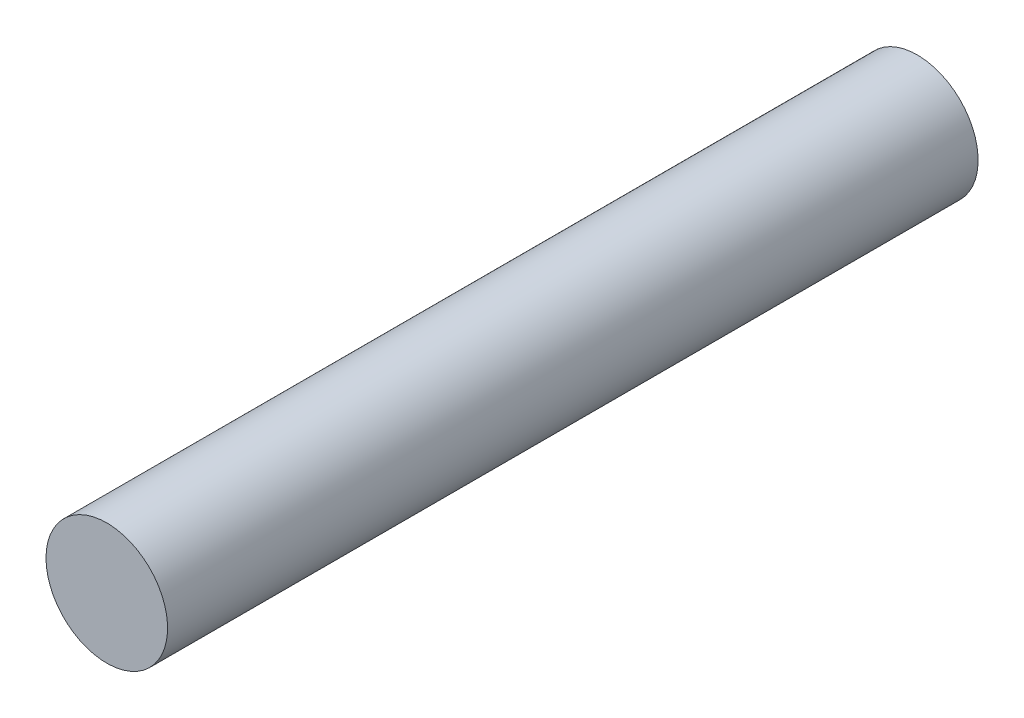
ISO-10303-21;
HEADER;
FILE_DESCRIPTION(('STEP AP214'),'2;1');
FILE_NAME('part.step','',(''),(''),'','','');
FILE_SCHEMA(('AUTOMOTIVE_DESIGN { 1 0 10303 214 1 1 1 1 }'));
ENDSEC;
DATA;
#1=APPLICATION_CONTEXT('core data for automotive mechanical design processes');
#2=APPLICATION_PROTOCOL_DEFINITION('international standard','automotive_design',2000,#1);
#3=PRODUCT_CONTEXT('',#1,'mechanical');
#4=PRODUCT('Part','Part','',(#3));
#5=PRODUCT_RELATED_PRODUCT_CATEGORY('part','',(#4));
#6=PRODUCT_DEFINITION_FORMATION('','',#4);
#7=PRODUCT_DEFINITION_CONTEXT('part definition',#1,'design');
#8=PRODUCT_DEFINITION('design','',#6,#7);
#9=PRODUCT_DEFINITION_SHAPE('','',#8);
#10=(LENGTH_UNIT() NAMED_UNIT(*) SI_UNIT(.MILLI.,.METRE.));
#11=(NAMED_UNIT(*) PLANE_ANGLE_UNIT() SI_UNIT($,.RADIAN.));
#12=(NAMED_UNIT(*) SI_UNIT($,.STERADIAN.) SOLID_ANGLE_UNIT());
#13=UNCERTAINTY_MEASURE_WITH_UNIT(LENGTH_MEASURE(1.E-05),#10,'distance_accuracy_value','');
#14=(GEOMETRIC_REPRESENTATION_CONTEXT(3) GLOBAL_UNCERTAINTY_ASSIGNED_CONTEXT((#13)) GLOBAL_UNIT_ASSIGNED_CONTEXT((#10,
#11,#12)) REPRESENTATION_CONTEXT('',''));
#15=CARTESIAN_POINT('',(0.,0.,0.));
#16=DIRECTION('',(0.,0.,1.));
#17=DIRECTION('',(1.,0.,0.));
#18=AXIS2_PLACEMENT_3D('',#15,#16,#17);
#19=CARTESIAN_POINT('',(0.2999994,0.,0.));
#20=DIRECTION('',(0.,0.,-1.));
#21=DIRECTION('',(-1.,0.,0.));
#22=AXIS2_PLACEMENT_3D('',#19,#20,#21);
#23=PLANE('',#22);
#24=CARTESIAN_POINT('',(0.,0.,0.));
#25=DIRECTION('',(0.,0.,-1.));
#26=DIRECTION('',(-1.,0.,0.));
#27=AXIS2_PLACEMENT_3D('',#24,#25,#26);
#28=CIRCLE('',#27,0.2999994);
#29=CARTESIAN_POINT('',(-0.2999994,0.,0.));
#30=VERTEX_POINT('',#29);
#31=EDGE_CURVE('E18',#30,#30,#28,.F.);
#32=ORIENTED_EDGE('',*,*,#31,.F.);
#33=EDGE_LOOP('',(#32));
#34=FACE_BOUND('',#33,.T.);
#35=ADVANCED_FACE('F15',(#34),#23,.T.);
#36=CARTESIAN_POINT('',(0.2999994,0.,3.99999962));
#37=DIRECTION('',(0.,0.,-1.));
#38=DIRECTION('',(-1.,0.,0.));
#39=AXIS2_PLACEMENT_3D('',#36,#37,#38);
#40=PLANE('',#39);
#41=CARTESIAN_POINT('',(0.,0.,3.99999962));
#42=DIRECTION('',(0.,0.,-1.));
#43=DIRECTION('',(-1.,0.,0.));
#44=AXIS2_PLACEMENT_3D('',#41,#42,#43);
#45=CIRCLE('',#44,0.2999994);
#46=CARTESIAN_POINT('',(-0.2999994,0.,3.99999962));
#47=VERTEX_POINT('',#46);
#48=EDGE_CURVE('E10',#47,#47,#45,.T.);
#49=ORIENTED_EDGE('',*,*,#48,.F.);
#50=EDGE_LOOP('',(#49));
#51=FACE_BOUND('',#50,.T.);
#52=ADVANCED_FACE('F30',(#51),#40,.F.);
#53=CARTESIAN_POINT('',(0.,0.,0.));
#54=DIRECTION('',(0.,0.,-1.));
#55=DIRECTION('',(-1.,0.,0.));
#56=AXIS2_PLACEMENT_3D('',#53,#54,#55);
#57=CYLINDRICAL_SURFACE('',#56,0.2999994);
#58=ORIENTED_EDGE('',*,*,#48,.T.);
#59=EDGE_LOOP('',(#58));
#60=FACE_BOUND('',#59,.T.);
#61=ORIENTED_EDGE('',*,*,#31,.T.);
#62=EDGE_LOOP('',(#61));
#63=FACE_BOUND('',#62,.T.);
#64=ADVANCED_FACE('F27',(#60,#63),#57,.T.);
#65=CLOSED_SHELL('',(#35,#52,#64));
#66=MANIFOLD_SOLID_BREP('B1',#65);
#67=ADVANCED_BREP_SHAPE_REPRESENTATION('',(#18,#66),#14);
#68=SHAPE_DEFINITION_REPRESENTATION(#9,#67);
ENDSEC;
END-ISO-10303-21;
